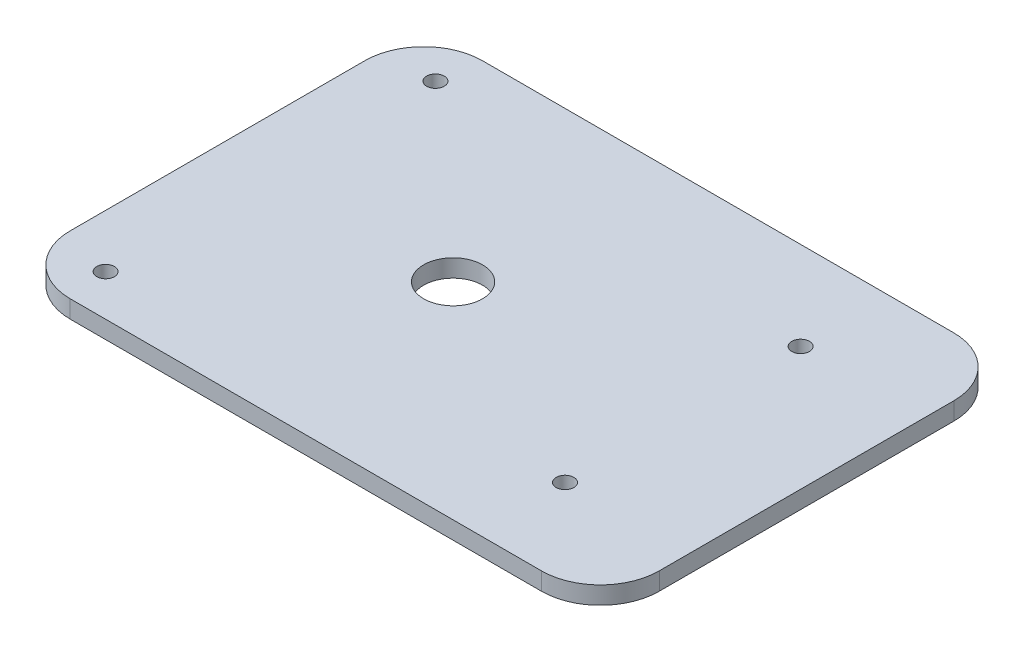
ISO-10303-21;
HEADER;
FILE_DESCRIPTION(('STEP AP214'),'2;1');
FILE_NAME('part.step','',(''),(''),'','','');
FILE_SCHEMA(('AUTOMOTIVE_DESIGN { 1 0 10303 214 1 1 1 1 }'));
ENDSEC;
DATA;
#1=APPLICATION_CONTEXT('core data for automotive mechanical design processes');
#2=APPLICATION_PROTOCOL_DEFINITION('international standard','automotive_design',2000,#1);
#3=PRODUCT_CONTEXT('',#1,'mechanical');
#4=PRODUCT('Part','Part','',(#3));
#5=PRODUCT_RELATED_PRODUCT_CATEGORY('part','',(#4));
#6=PRODUCT_DEFINITION_FORMATION('','',#4);
#7=PRODUCT_DEFINITION_CONTEXT('part definition',#1,'design');
#8=PRODUCT_DEFINITION('design','',#6,#7);
#9=PRODUCT_DEFINITION_SHAPE('','',#8);
#10=(LENGTH_UNIT() NAMED_UNIT(*) SI_UNIT(.MILLI.,.METRE.));
#11=(NAMED_UNIT(*) PLANE_ANGLE_UNIT() SI_UNIT($,.RADIAN.));
#12=(NAMED_UNIT(*) SI_UNIT($,.STERADIAN.) SOLID_ANGLE_UNIT());
#13=UNCERTAINTY_MEASURE_WITH_UNIT(LENGTH_MEASURE(1.E-05),#10,'distance_accuracy_value','');
#14=(GEOMETRIC_REPRESENTATION_CONTEXT(3) GLOBAL_UNCERTAINTY_ASSIGNED_CONTEXT((#13)) GLOBAL_UNIT_ASSIGNED_CONTEXT((#10,
#11,#12)) REPRESENTATION_CONTEXT('',''));
#15=CARTESIAN_POINT('',(0.,0.,0.));
#16=DIRECTION('',(0.,0.,1.));
#17=DIRECTION('',(1.,0.,0.));
#18=AXIS2_PLACEMENT_3D('',#15,#16,#17);
#19=CARTESIAN_POINT('',(-40.,3.,-35.));
#20=DIRECTION('',(1.,0.,0.));
#21=DIRECTION('',(0.,0.,-1.));
#22=AXIS2_PLACEMENT_3D('',#19,#20,#21);
#23=PLANE('',#22);
#24=DIRECTION('',(0.,0.,1.));
#25=VECTOR('',#24,1.);
#26=CARTESIAN_POINT('',(-40.,3.,-35.));
#27=LINE('',#26,#25);
#28=CARTESIAN_POINT('',(-40.,3.,-25.));
#29=VERTEX_POINT('',#28);
#30=CARTESIAN_POINT('',(-40.,3.,25.));
#31=VERTEX_POINT('',#30);
#32=EDGE_CURVE('E122',#29,#31,#27,.T.);
#33=ORIENTED_EDGE('',*,*,#32,.F.);
#34=DIRECTION('',(0.,-1.,0.));
#35=VECTOR('',#34,1.);
#36=CARTESIAN_POINT('',(-40.,3.,-25.));
#37=LINE('',#36,#35);
#38=CARTESIAN_POINT('',(-40.,0.,-25.));
#39=VERTEX_POINT('',#38);
#40=EDGE_CURVE('E107',#29,#39,#37,.T.);
#41=ORIENTED_EDGE('',*,*,#40,.T.);
#42=DIRECTION('',(0.,0.,1.));
#43=VECTOR('',#42,1.);
#44=CARTESIAN_POINT('',(-40.,0.,-35.));
#45=LINE('',#44,#43);
#46=CARTESIAN_POINT('',(-40.,0.,25.));
#47=VERTEX_POINT('',#46);
#48=EDGE_CURVE('E119',#39,#47,#45,.T.);
#49=ORIENTED_EDGE('',*,*,#48,.T.);
#50=DIRECTION('',(0.,-1.,0.));
#51=VECTOR('',#50,1.);
#52=CARTESIAN_POINT('',(-40.,3.,25.));
#53=LINE('',#52,#51);
#54=EDGE_CURVE('E124',#47,#31,#53,.F.);
#55=ORIENTED_EDGE('',*,*,#54,.T.);
#56=EDGE_LOOP('',(#33,#41,#49,#55));
#57=FACE_BOUND('',#56,.T.);
#58=ADVANCED_FACE('F37',(#57),#23,.F.);
#59=CARTESIAN_POINT('',(-40.,3.,35.));
#60=DIRECTION('',(0.,0.,-1.));
#61=DIRECTION('',(-1.,0.,0.));
#62=AXIS2_PLACEMENT_3D('',#59,#60,#61);
#63=PLANE('',#62);
#64=DIRECTION('',(1.,0.,0.));
#65=VECTOR('',#64,1.);
#66=CARTESIAN_POINT('',(-40.,0.,35.));
#67=LINE('',#66,#65);
#68=CARTESIAN_POINT('',(-30.,0.,35.));
#69=VERTEX_POINT('',#68);
#70=CARTESIAN_POINT('',(50.,0.,35.));
#71=VERTEX_POINT('',#70);
#72=EDGE_CURVE('E128',#69,#71,#67,.T.);
#73=ORIENTED_EDGE('',*,*,#72,.T.);
#74=DIRECTION('',(0.,-1.,0.));
#75=VECTOR('',#74,1.);
#76=CARTESIAN_POINT('',(50.,3.,35.));
#77=LINE('',#76,#75);
#78=CARTESIAN_POINT('',(50.,3.,35.));
#79=VERTEX_POINT('',#78);
#80=EDGE_CURVE('E11',#71,#79,#77,.F.);
#81=ORIENTED_EDGE('',*,*,#80,.T.);
#82=DIRECTION('',(1.,0.,0.));
#83=VECTOR('',#82,1.);
#84=CARTESIAN_POINT('',(-40.,3.,35.));
#85=LINE('',#84,#83);
#86=CARTESIAN_POINT('',(-30.,3.,35.));
#87=VERTEX_POINT('',#86);
#88=EDGE_CURVE('E168',#87,#79,#85,.T.);
#89=ORIENTED_EDGE('',*,*,#88,.F.);
#90=DIRECTION('',(0.,-1.,0.));
#91=VECTOR('',#90,1.);
#92=CARTESIAN_POINT('',(-30.,3.,35.));
#93=LINE('',#92,#91);
#94=EDGE_CURVE('E45',#87,#69,#93,.T.);
#95=ORIENTED_EDGE('',*,*,#94,.T.);
#96=EDGE_LOOP('',(#73,#81,#89,#95));
#97=FACE_BOUND('',#96,.T.);
#98=ADVANCED_FACE('F166',(#97),#63,.F.);
#99=CARTESIAN_POINT('',(60.,3.,-35.));
#100=DIRECTION('',(-1.,0.,0.));
#101=DIRECTION('',(0.,0.,1.));
#102=AXIS2_PLACEMENT_3D('',#99,#100,#101);
#103=PLANE('',#102);
#104=DIRECTION('',(0.,0.,-1.));
#105=VECTOR('',#104,1.);
#106=CARTESIAN_POINT('',(60.,0.,-35.));
#107=LINE('',#106,#105);
#108=CARTESIAN_POINT('',(60.,0.,25.));
#109=VERTEX_POINT('',#108);
#110=CARTESIAN_POINT('',(60.,0.,-25.));
#111=VERTEX_POINT('',#110);
#112=EDGE_CURVE('E132',#109,#111,#107,.T.);
#113=ORIENTED_EDGE('',*,*,#112,.T.);
#114=DIRECTION('',(0.,-1.,0.));
#115=VECTOR('',#114,1.);
#116=CARTESIAN_POINT('',(60.,3.,-25.));
#117=LINE('',#116,#115);
#118=CARTESIAN_POINT('',(60.,3.,-25.));
#119=VERTEX_POINT('',#118);
#120=EDGE_CURVE('E52',#111,#119,#117,.F.);
#121=ORIENTED_EDGE('',*,*,#120,.T.);
#122=DIRECTION('',(0.,0.,-1.));
#123=VECTOR('',#122,1.);
#124=CARTESIAN_POINT('',(60.,3.,-35.));
#125=LINE('',#124,#123);
#126=CARTESIAN_POINT('',(60.,3.,25.));
#127=VERTEX_POINT('',#126);
#128=EDGE_CURVE('E176',#127,#119,#125,.T.);
#129=ORIENTED_EDGE('',*,*,#128,.F.);
#130=DIRECTION('',(0.,-1.,0.));
#131=VECTOR('',#130,1.);
#132=CARTESIAN_POINT('',(60.,3.,25.));
#133=LINE('',#132,#131);
#134=EDGE_CURVE('E159',#127,#109,#133,.T.);
#135=ORIENTED_EDGE('',*,*,#134,.T.);
#136=EDGE_LOOP('',(#113,#121,#129,#135));
#137=FACE_BOUND('',#136,.T.);
#138=ADVANCED_FACE('F175',(#137),#103,.F.);
#139=CARTESIAN_POINT('',(-40.,3.,-35.));
#140=DIRECTION('',(0.,0.,1.));
#141=DIRECTION('',(1.,0.,0.));
#142=AXIS2_PLACEMENT_3D('',#139,#140,#141);
#143=PLANE('',#142);
#144=DIRECTION('',(-1.,0.,0.));
#145=VECTOR('',#144,1.);
#146=CARTESIAN_POINT('',(-40.,0.,-35.));
#147=LINE('',#146,#145);
#148=CARTESIAN_POINT('',(50.,0.,-35.));
#149=VERTEX_POINT('',#148);
#150=CARTESIAN_POINT('',(-30.,0.,-35.));
#151=VERTEX_POINT('',#150);
#152=EDGE_CURVE('E142',#149,#151,#147,.T.);
#153=ORIENTED_EDGE('',*,*,#152,.T.);
#154=DIRECTION('',(0.,-1.,0.));
#155=VECTOR('',#154,1.);
#156=CARTESIAN_POINT('',(-30.,3.,-35.));
#157=LINE('',#156,#155);
#158=CARTESIAN_POINT('',(-30.,3.,-35.));
#159=VERTEX_POINT('',#158);
#160=EDGE_CURVE('E108',#151,#159,#157,.F.);
#161=ORIENTED_EDGE('',*,*,#160,.T.);
#162=DIRECTION('',(-1.,0.,0.));
#163=VECTOR('',#162,1.);
#164=CARTESIAN_POINT('',(-40.,3.,-35.));
#165=LINE('',#164,#163);
#166=CARTESIAN_POINT('',(50.,3.,-35.));
#167=VERTEX_POINT('',#166);
#168=EDGE_CURVE('E138',#167,#159,#165,.T.);
#169=ORIENTED_EDGE('',*,*,#168,.F.);
#170=DIRECTION('',(0.,-1.,0.));
#171=VECTOR('',#170,1.);
#172=CARTESIAN_POINT('',(50.,3.,-35.));
#173=LINE('',#172,#171);
#174=EDGE_CURVE('E113',#167,#149,#173,.T.);
#175=ORIENTED_EDGE('',*,*,#174,.T.);
#176=EDGE_LOOP('',(#153,#161,#169,#175));
#177=FACE_BOUND('',#176,.T.);
#178=ADVANCED_FACE('F232',(#177),#143,.F.);
#179=CARTESIAN_POINT('',(0.,3.,0.));
#180=DIRECTION('',(0.,1.,0.));
#181=DIRECTION('',(0.,0.,1.));
#182=AXIS2_PLACEMENT_3D('',#179,#180,#181);
#183=PLANE('',#182);
#184=CARTESIAN_POINT('',(39.,3.,20.));
#185=DIRECTION('',(0.,-1.,0.));
#186=DIRECTION('',(0.,0.,-1.));
#187=AXIS2_PLACEMENT_3D('',#184,#185,#186);
#188=CIRCLE('',#187,1.5);
#189=CARTESIAN_POINT('',(39.,3.,18.5));
#190=VERTEX_POINT('',#189);
#191=EDGE_CURVE('E203',#190,#190,#188,.T.);
#192=ORIENTED_EDGE('',*,*,#191,.T.);
#193=EDGE_LOOP('',(#192));
#194=FACE_BOUND('',#193,.T.);
#195=CARTESIAN_POINT('',(-31.,3.,28.));
#196=DIRECTION('',(0.,-1.,0.));
#197=DIRECTION('',(0.,0.,-1.));
#198=AXIS2_PLACEMENT_3D('',#195,#196,#197);
#199=CIRCLE('',#198,1.5);
#200=CARTESIAN_POINT('',(-31.,3.,26.5));
#201=VERTEX_POINT('',#200);
#202=EDGE_CURVE('E197',#201,#201,#199,.T.);
#203=ORIENTED_EDGE('',*,*,#202,.T.);
#204=EDGE_LOOP('',(#203));
#205=FACE_BOUND('',#204,.T.);
#206=CARTESIAN_POINT('',(39.,3.,-20.));
#207=DIRECTION('',(0.,1.,0.));
#208=DIRECTION('',(0.,0.,1.));
#209=AXIS2_PLACEMENT_3D('',#206,#207,#208);
#210=CIRCLE('',#209,1.5);
#211=CARTESIAN_POINT('',(39.,3.,-18.5));
#212=VERTEX_POINT('',#211);
#213=EDGE_CURVE('E191',#212,#212,#210,.T.);
#214=ORIENTED_EDGE('',*,*,#213,.F.);
#215=EDGE_LOOP('',(#214));
#216=FACE_BOUND('',#215,.T.);
#217=CARTESIAN_POINT('',(-31.,3.,-28.));
#218=DIRECTION('',(0.,1.,0.));
#219=DIRECTION('',(0.,0.,1.));
#220=AXIS2_PLACEMENT_3D('',#217,#218,#219);
#221=CIRCLE('',#220,1.5);
#222=CARTESIAN_POINT('',(-31.,3.,-26.5));
#223=VERTEX_POINT('',#222);
#224=EDGE_CURVE('E185',#223,#223,#221,.T.);
#225=ORIENTED_EDGE('',*,*,#224,.F.);
#226=EDGE_LOOP('',(#225));
#227=FACE_BOUND('',#226,.T.);
#228=CARTESIAN_POINT('',(0.,3.,0.));
#229=DIRECTION('',(0.,1.,0.));
#230=DIRECTION('',(0.,0.,1.));
#231=AXIS2_PLACEMENT_3D('',#228,#229,#230);
#232=CIRCLE('',#231,5.);
#233=CARTESIAN_POINT('',(0.,3.,5.));
#234=VERTEX_POINT('',#233);
#235=EDGE_CURVE('E135',#234,#234,#232,.T.);
#236=ORIENTED_EDGE('',*,*,#235,.F.);
#237=EDGE_LOOP('',(#236));
#238=FACE_BOUND('',#237,.T.);
#239=ORIENTED_EDGE('',*,*,#168,.T.);
#240=CARTESIAN_POINT('',(-30.,3.,-25.));
#241=DIRECTION('',(0.,1.,0.));
#242=DIRECTION('',(0.,0.,1.));
#243=AXIS2_PLACEMENT_3D('',#240,#241,#242);
#244=CIRCLE('',#243,10.);
#245=EDGE_CURVE('E157',#159,#29,#244,.T.);
#246=ORIENTED_EDGE('',*,*,#245,.T.);
#247=ORIENTED_EDGE('',*,*,#32,.T.);
#248=CARTESIAN_POINT('',(-30.,3.,25.));
#249=DIRECTION('',(0.,1.,0.));
#250=DIRECTION('',(0.,0.,1.));
#251=AXIS2_PLACEMENT_3D('',#248,#249,#250);
#252=CIRCLE('',#251,10.);
#253=EDGE_CURVE('E152',#31,#87,#252,.T.);
#254=ORIENTED_EDGE('',*,*,#253,.T.);
#255=ORIENTED_EDGE('',*,*,#88,.T.);
#256=CARTESIAN_POINT('',(50.,3.,25.));
#257=DIRECTION('',(0.,1.,0.));
#258=DIRECTION('',(0.,0.,1.));
#259=AXIS2_PLACEMENT_3D('',#256,#257,#258);
#260=CIRCLE('',#259,10.);
#261=EDGE_CURVE('E59',#79,#127,#260,.T.);
#262=ORIENTED_EDGE('',*,*,#261,.T.);
#263=ORIENTED_EDGE('',*,*,#128,.T.);
#264=CARTESIAN_POINT('',(50.,3.,-25.));
#265=DIRECTION('',(0.,1.,0.));
#266=DIRECTION('',(0.,0.,1.));
#267=AXIS2_PLACEMENT_3D('',#264,#265,#266);
#268=CIRCLE('',#267,10.);
#269=EDGE_CURVE('E155',#119,#167,#268,.T.);
#270=ORIENTED_EDGE('',*,*,#269,.T.);
#271=EDGE_LOOP('',(#239,#246,#247,#254,#255,#262,#263,#270));
#272=FACE_BOUND('',#271,.T.);
#273=ADVANCED_FACE('F214',(#194,#205,#216,#227,#238,#272),#183,.T.);
#274=CARTESIAN_POINT('',(0.,0.,0.));
#275=DIRECTION('',(0.,1.,0.));
#276=DIRECTION('',(0.,0.,1.));
#277=AXIS2_PLACEMENT_3D('',#274,#275,#276);
#278=PLANE('',#277);
#279=CARTESIAN_POINT('',(39.,0.,20.));
#280=DIRECTION('',(0.,-1.,0.));
#281=DIRECTION('',(0.,0.,-1.));
#282=AXIS2_PLACEMENT_3D('',#279,#280,#281);
#283=CIRCLE('',#282,1.5);
#284=CARTESIAN_POINT('',(39.,0.,18.5));
#285=VERTEX_POINT('',#284);
#286=EDGE_CURVE('E200',#285,#285,#283,.T.);
#287=ORIENTED_EDGE('',*,*,#286,.F.);
#288=EDGE_LOOP('',(#287));
#289=FACE_BOUND('',#288,.T.);
#290=CARTESIAN_POINT('',(-31.,0.,28.));
#291=DIRECTION('',(0.,-1.,0.));
#292=DIRECTION('',(0.,0.,-1.));
#293=AXIS2_PLACEMENT_3D('',#290,#291,#292);
#294=CIRCLE('',#293,1.5);
#295=CARTESIAN_POINT('',(-31.,0.,26.5));
#296=VERTEX_POINT('',#295);
#297=EDGE_CURVE('E194',#296,#296,#294,.T.);
#298=ORIENTED_EDGE('',*,*,#297,.F.);
#299=EDGE_LOOP('',(#298));
#300=FACE_BOUND('',#299,.T.);
#301=CARTESIAN_POINT('',(39.,0.,-20.));
#302=DIRECTION('',(0.,1.,0.));
#303=DIRECTION('',(0.,0.,1.));
#304=AXIS2_PLACEMENT_3D('',#301,#302,#303);
#305=CIRCLE('',#304,1.5);
#306=CARTESIAN_POINT('',(39.,0.,-18.5));
#307=VERTEX_POINT('',#306);
#308=EDGE_CURVE('E188',#307,#307,#305,.T.);
#309=ORIENTED_EDGE('',*,*,#308,.T.);
#310=EDGE_LOOP('',(#309));
#311=FACE_BOUND('',#310,.T.);
#312=CARTESIAN_POINT('',(-31.,0.,-28.));
#313=DIRECTION('',(0.,1.,0.));
#314=DIRECTION('',(0.,0.,1.));
#315=AXIS2_PLACEMENT_3D('',#312,#313,#314);
#316=CIRCLE('',#315,1.5);
#317=CARTESIAN_POINT('',(-31.,0.,-26.5));
#318=VERTEX_POINT('',#317);
#319=EDGE_CURVE('E183',#318,#318,#316,.T.);
#320=ORIENTED_EDGE('',*,*,#319,.T.);
#321=EDGE_LOOP('',(#320));
#322=FACE_BOUND('',#321,.T.);
#323=CARTESIAN_POINT('',(0.,0.,0.));
#324=DIRECTION('',(0.,1.,0.));
#325=DIRECTION('',(0.,0.,1.));
#326=AXIS2_PLACEMENT_3D('',#323,#324,#325);
#327=CIRCLE('',#326,5.);
#328=CARTESIAN_POINT('',(0.,0.,5.));
#329=VERTEX_POINT('',#328);
#330=EDGE_CURVE('E129',#329,#329,#327,.T.);
#331=ORIENTED_EDGE('',*,*,#330,.T.);
#332=EDGE_LOOP('',(#331));
#333=FACE_BOUND('',#332,.T.);
#334=ORIENTED_EDGE('',*,*,#48,.F.);
#335=CARTESIAN_POINT('',(-30.,0.,-25.));
#336=DIRECTION('',(0.,1.,0.));
#337=DIRECTION('',(0.,0.,1.));
#338=AXIS2_PLACEMENT_3D('',#335,#336,#337);
#339=CIRCLE('',#338,10.);
#340=EDGE_CURVE('E103',#39,#151,#339,.F.);
#341=ORIENTED_EDGE('',*,*,#340,.T.);
#342=ORIENTED_EDGE('',*,*,#152,.F.);
#343=CARTESIAN_POINT('',(50.,0.,-25.));
#344=DIRECTION('',(0.,1.,0.));
#345=DIRECTION('',(0.,0.,1.));
#346=AXIS2_PLACEMENT_3D('',#343,#344,#345);
#347=CIRCLE('',#346,10.);
#348=EDGE_CURVE('E114',#149,#111,#347,.F.);
#349=ORIENTED_EDGE('',*,*,#348,.T.);
#350=ORIENTED_EDGE('',*,*,#112,.F.);
#351=CARTESIAN_POINT('',(50.,0.,25.));
#352=DIRECTION('',(0.,1.,0.));
#353=DIRECTION('',(0.,0.,1.));
#354=AXIS2_PLACEMENT_3D('',#351,#352,#353);
#355=CIRCLE('',#354,10.);
#356=EDGE_CURVE('E146',#109,#71,#355,.F.);
#357=ORIENTED_EDGE('',*,*,#356,.T.);
#358=ORIENTED_EDGE('',*,*,#72,.F.);
#359=CARTESIAN_POINT('',(-30.,0.,25.));
#360=DIRECTION('',(0.,1.,0.));
#361=DIRECTION('',(0.,0.,1.));
#362=AXIS2_PLACEMENT_3D('',#359,#360,#361);
#363=CIRCLE('',#362,10.);
#364=EDGE_CURVE('E123',#69,#47,#363,.F.);
#365=ORIENTED_EDGE('',*,*,#364,.T.);
#366=EDGE_LOOP('',(#334,#341,#342,#349,#350,#357,#358,#365));
#367=FACE_BOUND('',#366,.T.);
#368=ADVANCED_FACE('F126',(#289,#300,#311,#322,#333,#367),#278,.F.);
#369=CARTESIAN_POINT('',(-30.,3.,-25.));
#370=DIRECTION('',(0.,-1.,0.));
#371=DIRECTION('',(0.,0.,-1.));
#372=AXIS2_PLACEMENT_3D('',#369,#370,#371);
#373=CYLINDRICAL_SURFACE('',#372,10.);
#374=ORIENTED_EDGE('',*,*,#245,.F.);
#375=ORIENTED_EDGE('',*,*,#160,.F.);
#376=ORIENTED_EDGE('',*,*,#340,.F.);
#377=ORIENTED_EDGE('',*,*,#40,.F.);
#378=EDGE_LOOP('',(#374,#375,#376,#377));
#379=FACE_BOUND('',#378,.T.);
#380=ADVANCED_FACE('F106',(#379),#373,.T.);
#381=CARTESIAN_POINT('',(50.,3.,-25.));
#382=DIRECTION('',(0.,-1.,0.));
#383=DIRECTION('',(0.,0.,-1.));
#384=AXIS2_PLACEMENT_3D('',#381,#382,#383);
#385=CYLINDRICAL_SURFACE('',#384,10.);
#386=ORIENTED_EDGE('',*,*,#269,.F.);
#387=ORIENTED_EDGE('',*,*,#120,.F.);
#388=ORIENTED_EDGE('',*,*,#348,.F.);
#389=ORIENTED_EDGE('',*,*,#174,.F.);
#390=EDGE_LOOP('',(#386,#387,#388,#389));
#391=FACE_BOUND('',#390,.T.);
#392=ADVANCED_FACE('F239',(#391),#385,.T.);
#393=CARTESIAN_POINT('',(50.,3.,25.));
#394=DIRECTION('',(0.,-1.,0.));
#395=DIRECTION('',(0.,0.,-1.));
#396=AXIS2_PLACEMENT_3D('',#393,#394,#395);
#397=CYLINDRICAL_SURFACE('',#396,10.);
#398=ORIENTED_EDGE('',*,*,#261,.F.);
#399=ORIENTED_EDGE('',*,*,#80,.F.);
#400=ORIENTED_EDGE('',*,*,#356,.F.);
#401=ORIENTED_EDGE('',*,*,#134,.F.);
#402=EDGE_LOOP('',(#398,#399,#400,#401));
#403=FACE_BOUND('',#402,.T.);
#404=ADVANCED_FACE('F174',(#403),#397,.T.);
#405=CARTESIAN_POINT('',(-30.,3.,25.));
#406=DIRECTION('',(0.,-1.,0.));
#407=DIRECTION('',(0.,0.,-1.));
#408=AXIS2_PLACEMENT_3D('',#405,#406,#407);
#409=CYLINDRICAL_SURFACE('',#408,10.);
#410=ORIENTED_EDGE('',*,*,#253,.F.);
#411=ORIENTED_EDGE('',*,*,#54,.F.);
#412=ORIENTED_EDGE('',*,*,#364,.F.);
#413=ORIENTED_EDGE('',*,*,#94,.F.);
#414=EDGE_LOOP('',(#410,#411,#412,#413));
#415=FACE_BOUND('',#414,.T.);
#416=ADVANCED_FACE('F39',(#415),#409,.T.);
#417=CARTESIAN_POINT('',(0.,0.,0.));
#418=DIRECTION('',(0.,1.,0.));
#419=DIRECTION('',(0.,0.,1.));
#420=AXIS2_PLACEMENT_3D('',#417,#418,#419);
#421=CYLINDRICAL_SURFACE('',#420,5.);
#422=ORIENTED_EDGE('',*,*,#330,.F.);
#423=EDGE_LOOP('',(#422));
#424=FACE_BOUND('',#423,.T.);
#425=ORIENTED_EDGE('',*,*,#235,.T.);
#426=EDGE_LOOP('',(#425));
#427=FACE_BOUND('',#426,.T.);
#428=ADVANCED_FACE('F224',(#424,#427),#421,.F.);
#429=CARTESIAN_POINT('',(-31.,0.,-28.));
#430=DIRECTION('',(0.,1.,0.));
#431=DIRECTION('',(0.,0.,1.));
#432=AXIS2_PLACEMENT_3D('',#429,#430,#431);
#433=CYLINDRICAL_SURFACE('',#432,1.5);
#434=ORIENTED_EDGE('',*,*,#319,.F.);
#435=EDGE_LOOP('',(#434));
#436=FACE_BOUND('',#435,.T.);
#437=ORIENTED_EDGE('',*,*,#224,.T.);
#438=EDGE_LOOP('',(#437));
#439=FACE_BOUND('',#438,.T.);
#440=ADVANCED_FACE('F227',(#436,#439),#433,.F.);
#441=CARTESIAN_POINT('',(39.,0.,-20.));
#442=DIRECTION('',(0.,1.,0.));
#443=DIRECTION('',(0.,0.,1.));
#444=AXIS2_PLACEMENT_3D('',#441,#442,#443);
#445=CYLINDRICAL_SURFACE('',#444,1.5);
#446=ORIENTED_EDGE('',*,*,#308,.F.);
#447=EDGE_LOOP('',(#446));
#448=FACE_BOUND('',#447,.T.);
#449=ORIENTED_EDGE('',*,*,#213,.T.);
#450=EDGE_LOOP('',(#449));
#451=FACE_BOUND('',#450,.T.);
#452=ADVANCED_FACE('F260',(#448,#451),#445,.F.);
#453=CARTESIAN_POINT('',(-31.,0.,28.));
#454=DIRECTION('',(0.,1.,0.));
#455=DIRECTION('',(0.,0.,1.));
#456=AXIS2_PLACEMENT_3D('',#453,#454,#455);
#457=CYLINDRICAL_SURFACE('',#456,1.5);
#458=ORIENTED_EDGE('',*,*,#297,.T.);
#459=EDGE_LOOP('',(#458));
#460=FACE_BOUND('',#459,.T.);
#461=ORIENTED_EDGE('',*,*,#202,.F.);
#462=EDGE_LOOP('',(#461));
#463=FACE_BOUND('',#462,.T.);
#464=ADVANCED_FACE('F264',(#460,#463),#457,.F.);
#465=CARTESIAN_POINT('',(39.,0.,20.));
#466=DIRECTION('',(0.,1.,0.));
#467=DIRECTION('',(0.,0.,1.));
#468=AXIS2_PLACEMENT_3D('',#465,#466,#467);
#469=CYLINDRICAL_SURFACE('',#468,1.5);
#470=ORIENTED_EDGE('',*,*,#286,.T.);
#471=EDGE_LOOP('',(#470));
#472=FACE_BOUND('',#471,.T.);
#473=ORIENTED_EDGE('',*,*,#191,.F.);
#474=EDGE_LOOP('',(#473));
#475=FACE_BOUND('',#474,.T.);
#476=ADVANCED_FACE('F209',(#472,#475),#469,.F.);
#477=CLOSED_SHELL('',(#58,#98,#138,#178,#273,#368,#380,#392,#404,#416,#428,#440,#452,#464,#476));
#478=MANIFOLD_SOLID_BREP('B2',#477);
#479=ADVANCED_BREP_SHAPE_REPRESENTATION('',(#18,#478),#14);
#480=SHAPE_DEFINITION_REPRESENTATION(#9,#479);
ENDSEC;
END-ISO-10303-21;
